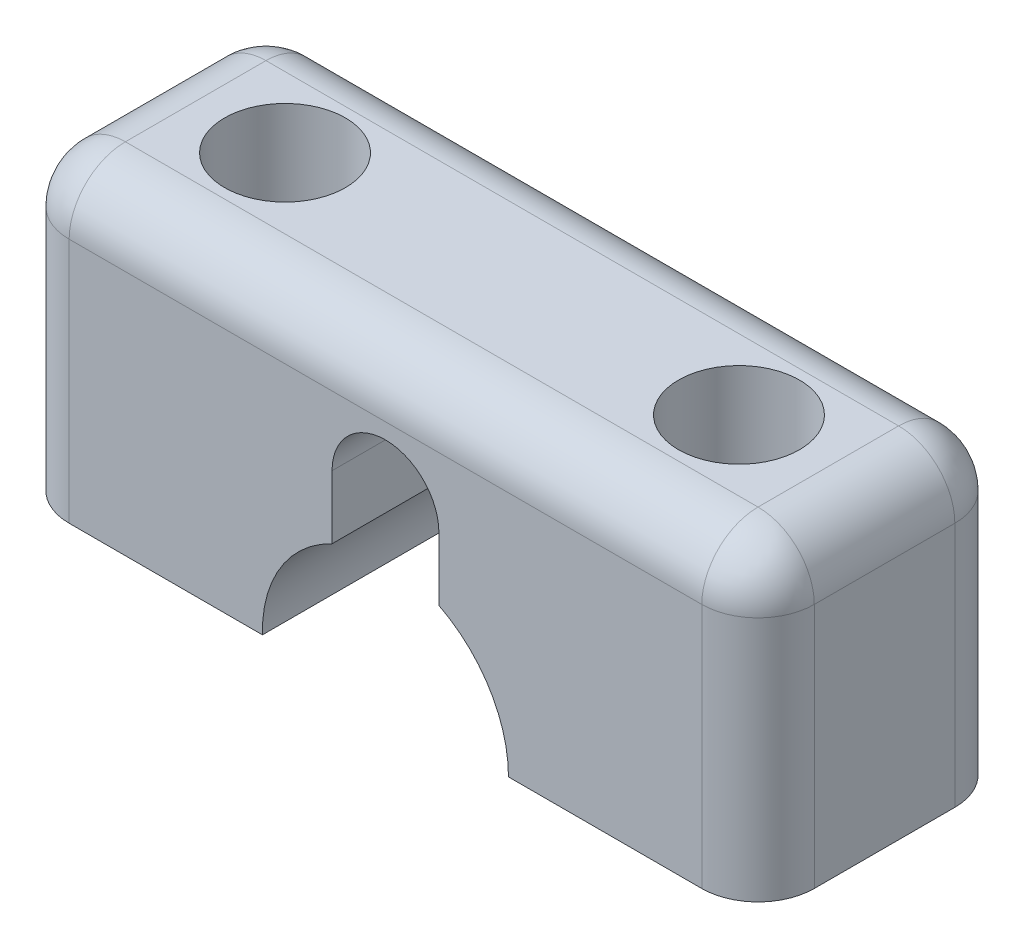
ISO-10303-21;
HEADER;
FILE_DESCRIPTION(('STEP AP214'),'2;1');
FILE_NAME('part.step','',(''),(''),'','','');
FILE_SCHEMA(('AUTOMOTIVE_DESIGN { 1 0 10303 214 1 1 1 1 }'));
ENDSEC;
DATA;
#1=APPLICATION_CONTEXT('core data for automotive mechanical design processes');
#2=APPLICATION_PROTOCOL_DEFINITION('international standard','automotive_design',2000,#1);
#3=PRODUCT_CONTEXT('',#1,'mechanical');
#4=PRODUCT('Part','Part','',(#3));
#5=PRODUCT_RELATED_PRODUCT_CATEGORY('part','',(#4));
#6=PRODUCT_DEFINITION_FORMATION('','',#4);
#7=PRODUCT_DEFINITION_CONTEXT('part definition',#1,'design');
#8=PRODUCT_DEFINITION('design','',#6,#7);
#9=PRODUCT_DEFINITION_SHAPE('','',#8);
#10=(LENGTH_UNIT() NAMED_UNIT(*) SI_UNIT(.MILLI.,.METRE.));
#11=(NAMED_UNIT(*) PLANE_ANGLE_UNIT() SI_UNIT($,.RADIAN.));
#12=(NAMED_UNIT(*) SI_UNIT($,.STERADIAN.) SOLID_ANGLE_UNIT());
#13=UNCERTAINTY_MEASURE_WITH_UNIT(LENGTH_MEASURE(1.E-05),#10,'distance_accuracy_value','');
#14=(GEOMETRIC_REPRESENTATION_CONTEXT(3) GLOBAL_UNCERTAINTY_ASSIGNED_CONTEXT((#13)) GLOBAL_UNIT_ASSIGNED_CONTEXT((#10,
#11,#12)) REPRESENTATION_CONTEXT('',''));
#15=CARTESIAN_POINT('',(0.,0.,0.));
#16=DIRECTION('',(0.,0.,1.));
#17=DIRECTION('',(1.,0.,0.));
#18=AXIS2_PLACEMENT_3D('',#15,#16,#17);
#19=CARTESIAN_POINT('',(0.,117.699465093686,100.));
#20=DIRECTION('',(0.,1.,0.));
#21=DIRECTION('',(0.,0.,1.));
#22=AXIS2_PLACEMENT_3D('',#19,#20,#21);
#23=PLANE('',#22);
#24=CARTESIAN_POINT('',(961.100411774361,117.699465093686,0.));
#25=DIRECTION('',(0.,1.,0.));
#26=DIRECTION('',(0.,0.,1.));
#27=AXIS2_PLACEMENT_3D('',#24,#25,#26);
#28=CIRCLE('',#27,42.9999999999999);
#29=CARTESIAN_POINT('',(961.100411774361,117.699465093686,42.9999999999999));
#30=VERTEX_POINT('',#29);
#31=EDGE_CURVE('E372',#30,#30,#28,.T.);
#32=ORIENTED_EDGE('',*,*,#31,.T.);
#33=EDGE_LOOP('',(#32));
#34=FACE_BOUND('',#33,.T.);
#35=DIRECTION('',(-1.,0.,0.));
#36=VECTOR('',#35,1.);
#37=CARTESIAN_POINT('',(1525.554159827,117.699465093686,179.999999999996));
#38=LINE('',#37,#36);
#39=CARTESIAN_POINT('',(1088.17560525442,117.699465093686,180.));
#40=VERTEX_POINT('',#39);
#41=CARTESIAN_POINT('',(813.175605254417,117.699465093686,180.000000000002));
#42=VERTEX_POINT('',#41);
#43=EDGE_CURVE('E177',#40,#42,#38,.T.);
#44=ORIENTED_EDGE('',*,*,#43,.T.);
#45=DIRECTION('',(0.,0.,-1.));
#46=VECTOR('',#45,1.);
#47=CARTESIAN_POINT('',(813.175605254417,117.699465093686,180.000000000002));
#48=LINE('',#47,#46);
#49=CARTESIAN_POINT('',(813.175605254417,117.699465093686,99.9999999999984));
#50=VERTEX_POINT('',#49);
#51=EDGE_CURVE('E159',#42,#50,#48,.T.);
#52=ORIENTED_EDGE('',*,*,#51,.T.);
#53=DIRECTION('',(0.,0.,-1.));
#54=VECTOR('',#53,1.);
#55=CARTESIAN_POINT('',(813.175605254417,117.699465093686,100.));
#56=LINE('',#55,#54);
#57=CARTESIAN_POINT('',(813.175605254416,117.699465093686,-99.9999999999983));
#58=VERTEX_POINT('',#57);
#59=EDGE_CURVE('E286',#50,#58,#56,.T.);
#60=ORIENTED_EDGE('',*,*,#59,.T.);
#61=CARTESIAN_POINT('',(813.175605254416,117.699465093685,-179.999999999999));
#62=VERTEX_POINT('',#61);
#63=EDGE_CURVE('E171',#58,#62,#48,.T.);
#64=ORIENTED_EDGE('',*,*,#63,.T.);
#65=DIRECTION('',(1.,0.,0.));
#66=VECTOR('',#65,1.);
#67=CARTESIAN_POINT('',(-249.202949318165,117.699465093686,-179.999999999995));
#68=LINE('',#67,#66);
#69=CARTESIAN_POINT('',(1088.17560525442,117.699465093686,-180.));
#70=VERTEX_POINT('',#69);
#71=EDGE_CURVE('E216',#62,#70,#68,.T.);
#72=ORIENTED_EDGE('',*,*,#71,.T.);
#73=CARTESIAN_POINT('',(1088.17560525442,117.699465093686,-100.));
#74=DIRECTION('',(0.,-1.,0.));
#75=DIRECTION('',(0.,0.,-1.));
#76=AXIS2_PLACEMENT_3D('',#73,#74,#75);
#77=CIRCLE('',#76,79.9999999999997);
#78=CARTESIAN_POINT('',(1168.17560525442,117.699465093686,-100.));
#79=VERTEX_POINT('',#78);
#80=EDGE_CURVE('E242',#70,#79,#77,.T.);
#81=ORIENTED_EDGE('',*,*,#80,.T.);
#82=DIRECTION('',(0.,0.,-1.));
#83=VECTOR('',#82,1.);
#84=CARTESIAN_POINT('',(1168.17560525442,117.699465093686,100.));
#85=LINE('',#84,#83);
#86=CARTESIAN_POINT('',(1168.17560525442,117.699465093686,100.));
#87=VERTEX_POINT('',#86);
#88=EDGE_CURVE('E284',#87,#79,#85,.T.);
#89=ORIENTED_EDGE('',*,*,#88,.F.);
#90=CARTESIAN_POINT('',(1088.17560525442,117.699465093686,100.));
#91=DIRECTION('',(0.,1.,0.));
#92=DIRECTION('',(0.,0.,1.));
#93=AXIS2_PLACEMENT_3D('',#90,#91,#92);
#94=CIRCLE('',#93,79.9999999999999);
#95=EDGE_CURVE('E185',#40,#87,#94,.T.);
#96=ORIENTED_EDGE('',*,*,#95,.F.);
#97=EDGE_LOOP('',(#44,#52,#60,#64,#72,#81,#89,#96));
#98=FACE_BOUND('',#97,.T.);
#99=ADVANCED_FACE('F35',(#34,#98),#23,.F.);
#100=CARTESIAN_POINT('',(0.,547.699465093685,100.));
#101=DIRECTION('',(0.,-1.,0.));
#102=DIRECTION('',(0.,0.,-1.));
#103=AXIS2_PLACEMENT_3D('',#100,#101,#102);
#104=PLANE('',#103);
#105=CARTESIAN_POINT('',(961.100411774361,547.699465093685,0.));
#106=DIRECTION('',(0.,1.,0.));
#107=DIRECTION('',(0.,0.,1.));
#108=AXIS2_PLACEMENT_3D('',#105,#106,#107);
#109=CIRCLE('',#108,86.0000000000002);
#110=CARTESIAN_POINT('',(961.100411774361,547.699465093685,86.0000000000002));
#111=VERTEX_POINT('',#110);
#112=EDGE_CURVE('E383',#111,#111,#109,.T.);
#113=ORIENTED_EDGE('',*,*,#112,.F.);
#114=EDGE_LOOP('',(#113));
#115=FACE_BOUND('',#114,.T.);
#116=CARTESIAN_POINT('',(315.250798734472,547.699465093685,1.11022302462516E-13));
#117=DIRECTION('',(0.,1.,0.));
#118=DIRECTION('',(0.,0.,-1.));
#119=AXIS2_PLACEMENT_3D('',#116,#117,#118);
#120=CIRCLE('',#119,86.0000000000002);
#121=CARTESIAN_POINT('',(315.250798734472,547.699465093685,-86.));
#122=VERTEX_POINT('',#121);
#123=EDGE_CURVE('E195',#122,#122,#120,.T.);
#124=ORIENTED_EDGE('',*,*,#123,.F.);
#125=EDGE_LOOP('',(#124));
#126=FACE_BOUND('',#125,.T.);
#127=DIRECTION('',(-1.,0.,0.));
#128=VECTOR('',#127,1.);
#129=CARTESIAN_POINT('',(0.,547.699465093685,-100.));
#130=LINE('',#129,#128);
#131=CARTESIAN_POINT('',(1088.17560525442,547.699465093686,-99.9999999999999));
#132=VERTEX_POINT('',#131);
#133=CARTESIAN_POINT('',(188.175605254416,547.699465093686,-99.9999999999967));
#134=VERTEX_POINT('',#133);
#135=EDGE_CURVE('E245',#132,#134,#130,.T.);
#136=ORIENTED_EDGE('',*,*,#135,.T.);
#137=DIRECTION('',(0.,0.,-1.));
#138=VECTOR('',#137,1.);
#139=CARTESIAN_POINT('',(188.175605254416,547.699465093685,100.));
#140=LINE('',#139,#138);
#141=CARTESIAN_POINT('',(188.175605254416,547.699465093685,100.));
#142=VERTEX_POINT('',#141);
#143=EDGE_CURVE('E11',#142,#134,#140,.T.);
#144=ORIENTED_EDGE('',*,*,#143,.F.);
#145=DIRECTION('',(-1.,0.,0.));
#146=VECTOR('',#145,1.);
#147=CARTESIAN_POINT('',(0.,547.699465093685,100.));
#148=LINE('',#147,#146);
#149=CARTESIAN_POINT('',(1088.17560525442,547.699465093685,100.));
#150=VERTEX_POINT('',#149);
#151=EDGE_CURVE('E246',#150,#142,#148,.T.);
#152=ORIENTED_EDGE('',*,*,#151,.F.);
#153=DIRECTION('',(0.,0.,-1.));
#154=VECTOR('',#153,1.);
#155=CARTESIAN_POINT('',(1088.17560525442,547.699465093685,100.));
#156=LINE('',#155,#154);
#157=EDGE_CURVE('E265',#150,#132,#156,.T.);
#158=ORIENTED_EDGE('',*,*,#157,.T.);
#159=EDGE_LOOP('',(#136,#144,#152,#158));
#160=FACE_BOUND('',#159,.T.);
#161=ADVANCED_FACE('F37',(#115,#126,#160),#104,.F.);
#162=CARTESIAN_POINT('',(188.175605254416,467.699465093685,100.));
#163=DIRECTION('',(0.,0.,-1.));
#164=DIRECTION('',(-1.,0.,0.));
#165=AXIS2_PLACEMENT_3D('',#162,#163,#164);
#166=CYLINDRICAL_SURFACE('',#165,80.0000000000001);
#167=CARTESIAN_POINT('',(188.175605254416,467.699465093685,-100.));
#168=DIRECTION('',(0.,0.,1.));
#169=DIRECTION('',(1.,0.,0.));
#170=AXIS2_PLACEMENT_3D('',#167,#168,#169);
#171=CIRCLE('',#170,80.0000000000001);
#172=CARTESIAN_POINT('',(108.175605254416,467.699465093685,-100.));
#173=VERTEX_POINT('',#172);
#174=EDGE_CURVE('E267',#134,#173,#171,.T.);
#175=ORIENTED_EDGE('',*,*,#174,.T.);
#176=DIRECTION('',(0.,0.,-1.));
#177=VECTOR('',#176,1.);
#178=CARTESIAN_POINT('',(108.175605254416,467.699465093685,100.));
#179=LINE('',#178,#177);
#180=CARTESIAN_POINT('',(108.175605254416,467.699465093685,100.));
#181=VERTEX_POINT('',#180);
#182=EDGE_CURVE('E43',#181,#173,#179,.T.);
#183=ORIENTED_EDGE('',*,*,#182,.F.);
#184=CARTESIAN_POINT('',(188.175605254416,467.699465093685,100.));
#185=DIRECTION('',(0.,0.,1.));
#186=DIRECTION('',(1.,0.,0.));
#187=AXIS2_PLACEMENT_3D('',#184,#185,#186);
#188=CIRCLE('',#187,80.0000000000001);
#189=EDGE_CURVE('E249',#142,#181,#188,.T.);
#190=ORIENTED_EDGE('',*,*,#189,.F.);
#191=ORIENTED_EDGE('',*,*,#143,.T.);
#192=EDGE_LOOP('',(#175,#183,#190,#191));
#193=FACE_BOUND('',#192,.T.);
#194=ADVANCED_FACE('F308',(#193),#166,.T.);
#195=CARTESIAN_POINT('',(108.175605254416,0.,100.));
#196=DIRECTION('',(1.,0.,0.));
#197=DIRECTION('',(0.,1.,0.));
#198=AXIS2_PLACEMENT_3D('',#195,#196,#197);
#199=PLANE('',#198);
#200=DIRECTION('',(0.,-1.,0.));
#201=VECTOR('',#200,1.);
#202=CARTESIAN_POINT('',(108.175605254416,0.,-100.));
#203=LINE('',#202,#201);
#204=CARTESIAN_POINT('',(108.175605254416,117.699465093686,-100.));
#205=VERTEX_POINT('',#204);
#206=EDGE_CURVE('E270',#173,#205,#203,.T.);
#207=ORIENTED_EDGE('',*,*,#206,.T.);
#208=DIRECTION('',(0.,0.,-1.));
#209=VECTOR('',#208,1.);
#210=CARTESIAN_POINT('',(108.175605254416,117.699465093686,100.));
#211=LINE('',#210,#209);
#212=CARTESIAN_POINT('',(108.175605254416,117.699465093686,100.));
#213=VERTEX_POINT('',#212);
#214=EDGE_CURVE('E297',#213,#205,#211,.T.);
#215=ORIENTED_EDGE('',*,*,#214,.F.);
#216=DIRECTION('',(0.,-1.,0.));
#217=VECTOR('',#216,1.);
#218=CARTESIAN_POINT('',(108.175605254416,0.,100.));
#219=LINE('',#218,#217);
#220=EDGE_CURVE('E253',#181,#213,#219,.T.);
#221=ORIENTED_EDGE('',*,*,#220,.F.);
#222=ORIENTED_EDGE('',*,*,#182,.T.);
#223=EDGE_LOOP('',(#207,#215,#221,#222));
#224=FACE_BOUND('',#223,.T.);
#225=ADVANCED_FACE('F303',(#224),#199,.F.);
#226=CARTESIAN_POINT('',(637.111532433096,122.421036494507,100.));
#227=DIRECTION('',(0.,0.,-1.));
#228=DIRECTION('',(-1.,0.,0.));
#229=AXIS2_PLACEMENT_3D('',#226,#227,#228);
#230=CYLINDRICAL_SURFACE('',#229,174.);
#231=DIRECTION('',(0.,0.,-1.));
#232=VECTOR('',#231,1.);
#233=CARTESIAN_POINT('',(463.175605254416,117.699465093686,100.));
#234=LINE('',#233,#232);
#235=CARTESIAN_POINT('',(463.175605254417,117.699465093686,180.000000000003));
#236=VERTEX_POINT('',#235);
#237=CARTESIAN_POINT('',(463.175605254416,117.699465093686,-179.999999999998));
#238=VERTEX_POINT('',#237);
#239=EDGE_CURVE('E50',#236,#238,#234,.T.);
#240=ORIENTED_EDGE('',*,*,#239,.T.);
#241=CARTESIAN_POINT('',(637.111532433095,122.421036494507,-179.999999999998));
#242=DIRECTION('',(0.,0.,-1.));
#243=DIRECTION('',(1.,0.,0.));
#244=AXIS2_PLACEMENT_3D('',#241,#242,#243);
#245=CIRCLE('',#244,174.);
#246=CARTESIAN_POINT('',(562.175605254416,279.457996532174,-179.999999999998));
#247=VERTEX_POINT('',#246);
#248=EDGE_CURVE('E677',#238,#247,#245,.T.);
#249=ORIENTED_EDGE('',*,*,#248,.T.);
#250=DIRECTION('',(0.,0.,-1.));
#251=VECTOR('',#250,1.);
#252=CARTESIAN_POINT('',(562.175605254416,279.457996532174,100.));
#253=LINE('',#252,#251);
#254=CARTESIAN_POINT('',(562.175605254417,279.457996532174,179.999999999999));
#255=VERTEX_POINT('',#254);
#256=EDGE_CURVE('E55',#255,#247,#253,.T.);
#257=ORIENTED_EDGE('',*,*,#256,.F.);
#258=CARTESIAN_POINT('',(637.111532433097,122.421036494507,180.000000000003));
#259=DIRECTION('',(0.,0.,-1.));
#260=DIRECTION('',(1.,0.,0.));
#261=AXIS2_PLACEMENT_3D('',#258,#259,#260);
#262=CIRCLE('',#261,174.);
#263=EDGE_CURVE('E181',#236,#255,#262,.T.);
#264=ORIENTED_EDGE('',*,*,#263,.F.);
#265=EDGE_LOOP('',(#240,#249,#257,#264));
#266=FACE_BOUND('',#265,.T.);
#267=ADVANCED_FACE('F482',(#266),#230,.F.);
#268=CARTESIAN_POINT('',(562.175605254416,0.,100.));
#269=DIRECTION('',(-1.,0.,0.));
#270=DIRECTION('',(0.,0.,1.));
#271=AXIS2_PLACEMENT_3D('',#268,#269,#270);
#272=PLANE('',#271);
#273=ORIENTED_EDGE('',*,*,#256,.T.);
#274=DIRECTION('',(0.,1.,0.));
#275=VECTOR('',#274,1.);
#276=CARTESIAN_POINT('',(562.175605254416,369.457996532174,-179.999999999998));
#277=LINE('',#276,#275);
#278=CARTESIAN_POINT('',(562.175605254416,369.457996532174,-179.999999999998));
#279=VERTEX_POINT('',#278);
#280=EDGE_CURVE('E672',#247,#279,#277,.T.);
#281=ORIENTED_EDGE('',*,*,#280,.T.);
#282=DIRECTION('',(0.,0.,-1.));
#283=VECTOR('',#282,1.);
#284=CARTESIAN_POINT('',(562.175605254416,369.457996532174,100.));
#285=LINE('',#284,#283);
#286=CARTESIAN_POINT('',(562.175605254417,369.457996532174,180.000000000003));
#287=VERTEX_POINT('',#286);
#288=EDGE_CURVE('E293',#287,#279,#285,.T.);
#289=ORIENTED_EDGE('',*,*,#288,.F.);
#290=DIRECTION('',(0.,1.,0.));
#291=VECTOR('',#290,1.);
#292=CARTESIAN_POINT('',(562.175605254417,369.457996532174,180.000000000003));
#293=LINE('',#292,#291);
#294=EDGE_CURVE('E681',#255,#287,#293,.T.);
#295=ORIENTED_EDGE('',*,*,#294,.F.);
#296=EDGE_LOOP('',(#273,#281,#289,#295));
#297=FACE_BOUND('',#296,.T.);
#298=ADVANCED_FACE('F478',(#297),#272,.F.);
#299=CARTESIAN_POINT('',(638.175605254416,369.457996532174,100.));
#300=DIRECTION('',(0.,0.,-1.));
#301=DIRECTION('',(-1.,0.,0.));
#302=AXIS2_PLACEMENT_3D('',#299,#300,#301);
#303=CYLINDRICAL_SURFACE('',#302,76.);
#304=ORIENTED_EDGE('',*,*,#288,.T.);
#305=CARTESIAN_POINT('',(638.175605254416,369.457996532174,-179.999999999998));
#306=DIRECTION('',(0.,0.,-1.));
#307=DIRECTION('',(1.,0.,0.));
#308=AXIS2_PLACEMENT_3D('',#305,#306,#307);
#309=CIRCLE('',#308,76.);
#310=CARTESIAN_POINT('',(714.175605254416,369.457996532174,-179.999999999999));
#311=VERTEX_POINT('',#310);
#312=EDGE_CURVE('E671',#279,#311,#309,.T.);
#313=ORIENTED_EDGE('',*,*,#312,.T.);
#314=DIRECTION('',(0.,0.,-1.));
#315=VECTOR('',#314,1.);
#316=CARTESIAN_POINT('',(714.175605254416,369.457996532174,100.));
#317=LINE('',#316,#315);
#318=CARTESIAN_POINT('',(714.175605254417,369.457996532174,180.000000000002));
#319=VERTEX_POINT('',#318);
#320=EDGE_CURVE('E291',#319,#311,#317,.T.);
#321=ORIENTED_EDGE('',*,*,#320,.F.);
#322=CARTESIAN_POINT('',(638.175605254417,369.457996532174,180.000000000002));
#323=DIRECTION('',(0.,0.,-1.));
#324=DIRECTION('',(1.,0.,0.));
#325=AXIS2_PLACEMENT_3D('',#322,#323,#324);
#326=CIRCLE('',#325,76.);
#327=EDGE_CURVE('E360',#287,#319,#326,.T.);
#328=ORIENTED_EDGE('',*,*,#327,.F.);
#329=EDGE_LOOP('',(#304,#313,#321,#328));
#330=FACE_BOUND('',#329,.T.);
#331=ADVANCED_FACE('F474',(#330),#303,.F.);
#332=CARTESIAN_POINT('',(714.175605254416,0.,100.));
#333=DIRECTION('',(-1.,0.,0.));
#334=DIRECTION('',(0.,0.,1.));
#335=AXIS2_PLACEMENT_3D('',#332,#333,#334);
#336=PLANE('',#335);
#337=ORIENTED_EDGE('',*,*,#320,.T.);
#338=DIRECTION('',(0.,-1.,0.));
#339=VECTOR('',#338,1.);
#340=CARTESIAN_POINT('',(714.175605254416,279.457996532174,-179.999999999998));
#341=LINE('',#340,#339);
#342=CARTESIAN_POINT('',(714.175605254416,279.457996532174,-179.999999999998));
#343=VERTEX_POINT('',#342);
#344=EDGE_CURVE('E182',#311,#343,#341,.T.);
#345=ORIENTED_EDGE('',*,*,#344,.T.);
#346=DIRECTION('',(0.,0.,-1.));
#347=VECTOR('',#346,1.);
#348=CARTESIAN_POINT('',(714.175605254417,279.457996532174,180.000000000002));
#349=LINE('',#348,#347);
#350=CARTESIAN_POINT('',(714.175605254416,279.457996532174,-99.9999999999985));
#351=VERTEX_POINT('',#350);
#352=EDGE_CURVE('E170',#351,#343,#349,.T.);
#353=ORIENTED_EDGE('',*,*,#352,.F.);
#354=DIRECTION('',(0.,0.,-1.));
#355=VECTOR('',#354,1.);
#356=CARTESIAN_POINT('',(714.175605254416,279.457996532174,100.));
#357=LINE('',#356,#355);
#358=CARTESIAN_POINT('',(714.175605254417,279.457996532174,99.9999999999982));
#359=VERTEX_POINT('',#358);
#360=EDGE_CURVE('E288',#359,#351,#357,.T.);
#361=ORIENTED_EDGE('',*,*,#360,.F.);
#362=CARTESIAN_POINT('',(714.175605254417,279.457996532174,180.000000000002));
#363=VERTEX_POINT('',#362);
#364=EDGE_CURVE('E364',#363,#359,#349,.T.);
#365=ORIENTED_EDGE('',*,*,#364,.F.);
#366=DIRECTION('',(0.,-1.,0.));
#367=VECTOR('',#366,1.);
#368=CARTESIAN_POINT('',(714.175605254417,279.457996532174,180.000000000002));
#369=LINE('',#368,#367);
#370=EDGE_CURVE('E180',#319,#363,#369,.T.);
#371=ORIENTED_EDGE('',*,*,#370,.F.);
#372=EDGE_LOOP('',(#337,#345,#353,#361,#365,#371));
#373=FACE_BOUND('',#372,.T.);
#374=ADVANCED_FACE('F470',(#373),#336,.T.);
#375=CARTESIAN_POINT('',(639.239678075737,122.421036494507,100.));
#376=DIRECTION('',(0.,0.,-1.));
#377=DIRECTION('',(-1.,0.,0.));
#378=AXIS2_PLACEMENT_3D('',#375,#376,#377);
#379=CYLINDRICAL_SURFACE('',#378,174.);
#380=CARTESIAN_POINT('',(639.239678075737,122.421036494507,-100.));
#381=DIRECTION('',(0.,0.,1.));
#382=DIRECTION('',(1.,0.,0.));
#383=AXIS2_PLACEMENT_3D('',#380,#381,#382);
#384=CIRCLE('',#383,174.);
#385=EDGE_CURVE('E273',#351,#58,#384,.F.);
#386=ORIENTED_EDGE('',*,*,#385,.T.);
#387=ORIENTED_EDGE('',*,*,#59,.F.);
#388=CARTESIAN_POINT('',(639.239678075737,122.421036494507,100.));
#389=DIRECTION('',(0.,0.,1.));
#390=DIRECTION('',(1.,0.,0.));
#391=AXIS2_PLACEMENT_3D('',#388,#389,#390);
#392=CIRCLE('',#391,174.);
#393=EDGE_CURVE('E256',#359,#50,#392,.F.);
#394=ORIENTED_EDGE('',*,*,#393,.F.);
#395=ORIENTED_EDGE('',*,*,#360,.T.);
#396=EDGE_LOOP('',(#386,#387,#394,#395));
#397=FACE_BOUND('',#396,.T.);
#398=ADVANCED_FACE('F466',(#397),#379,.F.);
#399=CARTESIAN_POINT('',(315.250798734472,117.699465093686,1.11022302462516E-13));
#400=DIRECTION('',(0.,1.,0.));
#401=DIRECTION('',(0.,0.,1.));
#402=AXIS2_PLACEMENT_3D('',#399,#400,#401);
#403=CIRCLE('',#402,42.9999999999999);
#404=CARTESIAN_POINT('',(315.250798734472,117.699465093686,43.));
#405=VERTEX_POINT('',#404);
#406=EDGE_CURVE('E378',#405,#405,#403,.T.);
#407=ORIENTED_EDGE('',*,*,#406,.T.);
#408=EDGE_LOOP('',(#407));
#409=FACE_BOUND('',#408,.T.);
#410=CARTESIAN_POINT('',(188.175605254417,117.699465093686,-180.));
#411=VERTEX_POINT('',#410);
#412=EDGE_CURVE('E217',#411,#238,#68,.T.);
#413=ORIENTED_EDGE('',*,*,#412,.T.);
#414=ORIENTED_EDGE('',*,*,#239,.F.);
#415=CARTESIAN_POINT('',(188.175605254417,117.699465093686,180.));
#416=VERTEX_POINT('',#415);
#417=EDGE_CURVE('E188',#236,#416,#38,.T.);
#418=ORIENTED_EDGE('',*,*,#417,.T.);
#419=CARTESIAN_POINT('',(188.175605254417,117.699465093686,100.));
#420=DIRECTION('',(0.,-1.,0.));
#421=DIRECTION('',(1.,0.,0.));
#422=AXIS2_PLACEMENT_3D('',#419,#420,#421);
#423=CIRCLE('',#422,80.0000000000004);
#424=EDGE_CURVE('E205',#416,#213,#423,.T.);
#425=ORIENTED_EDGE('',*,*,#424,.T.);
#426=ORIENTED_EDGE('',*,*,#214,.T.);
#427=CARTESIAN_POINT('',(188.175605254416,117.699465093686,-100.));
#428=DIRECTION('',(0.,1.,0.));
#429=DIRECTION('',(0.,0.,1.));
#430=AXIS2_PLACEMENT_3D('',#427,#428,#429);
#431=CIRCLE('',#430,80.0000000000001);
#432=EDGE_CURVE('E231',#411,#205,#431,.T.);
#433=ORIENTED_EDGE('',*,*,#432,.F.);
#434=EDGE_LOOP('',(#413,#414,#418,#425,#426,#433));
#435=FACE_BOUND('',#434,.T.);
#436=ADVANCED_FACE('F327',(#409,#435),#23,.F.);
#437=CARTESIAN_POINT('',(1168.17560525442,-7.41105973576503E-13,100.));
#438=DIRECTION('',(-1.,0.,0.));
#439=DIRECTION('',(0.,-1.,0.));
#440=AXIS2_PLACEMENT_3D('',#437,#438,#439);
#441=PLANE('',#440);
#442=DIRECTION('',(0.,1.,0.));
#443=VECTOR('',#442,1.);
#444=CARTESIAN_POINT('',(1168.17560525442,-7.41105973576503E-13,-100.));
#445=LINE('',#444,#443);
#446=CARTESIAN_POINT('',(1168.17560525442,467.699465093686,-100.));
#447=VERTEX_POINT('',#446);
#448=EDGE_CURVE('E276',#79,#447,#445,.T.);
#449=ORIENTED_EDGE('',*,*,#448,.T.);
#450=DIRECTION('',(0.,0.,-1.));
#451=VECTOR('',#450,1.);
#452=CARTESIAN_POINT('',(1168.17560525442,467.699465093686,100.));
#453=LINE('',#452,#451);
#454=CARTESIAN_POINT('',(1168.17560525442,467.699465093686,100.));
#455=VERTEX_POINT('',#454);
#456=EDGE_CURVE('E281',#455,#447,#453,.T.);
#457=ORIENTED_EDGE('',*,*,#456,.F.);
#458=DIRECTION('',(0.,1.,0.));
#459=VECTOR('',#458,1.);
#460=CARTESIAN_POINT('',(1168.17560525442,-7.41105973576503E-13,100.));
#461=LINE('',#460,#459);
#462=EDGE_CURVE('E259',#87,#455,#461,.T.);
#463=ORIENTED_EDGE('',*,*,#462,.F.);
#464=ORIENTED_EDGE('',*,*,#88,.T.);
#465=EDGE_LOOP('',(#449,#457,#463,#464));
#466=FACE_BOUND('',#465,.T.);
#467=ADVANCED_FACE('F461',(#466),#441,.F.);
#468=CARTESIAN_POINT('',(1088.17560525442,467.699465093686,100.));
#469=DIRECTION('',(0.,0.,-1.));
#470=DIRECTION('',(-1.,0.,0.));
#471=AXIS2_PLACEMENT_3D('',#468,#469,#470);
#472=CYLINDRICAL_SURFACE('',#471,80.);
#473=CARTESIAN_POINT('',(1088.17560525442,467.699465093686,-100.));
#474=DIRECTION('',(0.,0.,1.));
#475=DIRECTION('',(1.,0.,0.));
#476=AXIS2_PLACEMENT_3D('',#473,#474,#475);
#477=CIRCLE('',#476,80.);
#478=EDGE_CURVE('E250',#447,#132,#477,.T.);
#479=ORIENTED_EDGE('',*,*,#478,.T.);
#480=ORIENTED_EDGE('',*,*,#157,.F.);
#481=CARTESIAN_POINT('',(1088.17560525442,467.699465093686,100.));
#482=DIRECTION('',(0.,0.,1.));
#483=DIRECTION('',(1.,0.,0.));
#484=AXIS2_PLACEMENT_3D('',#481,#482,#483);
#485=CIRCLE('',#484,80.);
#486=EDGE_CURVE('E262',#455,#150,#485,.T.);
#487=ORIENTED_EDGE('',*,*,#486,.F.);
#488=ORIENTED_EDGE('',*,*,#456,.T.);
#489=EDGE_LOOP('',(#479,#480,#487,#488));
#490=FACE_BOUND('',#489,.T.);
#491=ADVANCED_FACE('F345',(#490),#472,.T.);
#492=CARTESIAN_POINT('',(1088.17560525442,467.699465093686,-100.));
#493=DIRECTION('',(0.,-1.,0.));
#494=DIRECTION('',(0.,0.,1.));
#495=AXIS2_PLACEMENT_3D('',#492,#493,#494);
#496=SPHERICAL_SURFACE('',#495,79.9999999999999);
#497=ORIENTED_EDGE('',*,*,#478,.F.);
#498=CARTESIAN_POINT('',(1088.17560525442,467.699465093686,-100.));
#499=DIRECTION('',(0.,-1.,0.));
#500=DIRECTION('',(0.,0.,-1.));
#501=AXIS2_PLACEMENT_3D('',#498,#499,#500);
#502=CIRCLE('',#501,79.9999999999999);
#503=CARTESIAN_POINT('',(1088.17560525442,467.699465093686,-180.));
#504=VERTEX_POINT('',#503);
#505=EDGE_CURVE('E239',#504,#447,#502,.T.);
#506=ORIENTED_EDGE('',*,*,#505,.F.);
#507=CARTESIAN_POINT('',(1088.17560525442,467.699465093686,-100.));
#508=DIRECTION('',(-1.,0.,0.));
#509=DIRECTION('',(0.,0.,-1.));
#510=AXIS2_PLACEMENT_3D('',#507,#508,#509);
#511=CIRCLE('',#510,79.9999999999999);
#512=EDGE_CURVE('E233',#132,#504,#511,.T.);
#513=ORIENTED_EDGE('',*,*,#512,.F.);
#514=EDGE_LOOP('',(#497,#506,#513));
#515=FACE_BOUND('',#514,.T.);
#516=ADVANCED_FACE('F348',(#515),#496,.T.);
#517=CARTESIAN_POINT('',(1088.17560525442,547.699465093686,-100.));
#518=DIRECTION('',(0.,-1.,0.));
#519=DIRECTION('',(0.,0.,-1.));
#520=AXIS2_PLACEMENT_3D('',#517,#518,#519);
#521=CYLINDRICAL_SURFACE('',#520,79.9999999999998);
#522=DIRECTION('',(0.,-1.,0.));
#523=VECTOR('',#522,1.);
#524=CARTESIAN_POINT('',(1088.17560525442,117.699465093686,-180.));
#525=LINE('',#524,#523);
#526=EDGE_CURVE('E236',#504,#70,#525,.T.);
#527=ORIENTED_EDGE('',*,*,#526,.F.);
#528=ORIENTED_EDGE('',*,*,#505,.T.);
#529=ORIENTED_EDGE('',*,*,#448,.F.);
#530=ORIENTED_EDGE('',*,*,#80,.F.);
#531=EDGE_LOOP('',(#527,#528,#529,#530));
#532=FACE_BOUND('',#531,.T.);
#533=ADVANCED_FACE('F353',(#532),#521,.T.);
#534=CARTESIAN_POINT('',(188.175605254416,467.699465093685,-99.9999999999998));
#535=DIRECTION('',(0.,1.,0.));
#536=DIRECTION('',(0.,0.,-1.));
#537=AXIS2_PLACEMENT_3D('',#534,#535,#536);
#538=SPHERICAL_SURFACE('',#537,80.0000000000002);
#539=ORIENTED_EDGE('',*,*,#174,.F.);
#540=CARTESIAN_POINT('',(188.175605254416,467.699465093685,-99.9999999999998));
#541=DIRECTION('',(1.,0.,0.));
#542=DIRECTION('',(0.,0.,-1.));
#543=AXIS2_PLACEMENT_3D('',#540,#541,#542);
#544=CIRCLE('',#543,80.0000000000002);
#545=CARTESIAN_POINT('',(188.175605254417,467.699465093685,-180.));
#546=VERTEX_POINT('',#545);
#547=EDGE_CURVE('E223',#546,#134,#544,.T.);
#548=ORIENTED_EDGE('',*,*,#547,.F.);
#549=CARTESIAN_POINT('',(188.175605254416,467.699465093685,-100.));
#550=DIRECTION('',(0.,1.,0.));
#551=DIRECTION('',(0.,0.,1.));
#552=AXIS2_PLACEMENT_3D('',#549,#550,#551);
#553=CIRCLE('',#552,80.);
#554=EDGE_CURVE('E229',#546,#173,#553,.T.);
#555=ORIENTED_EDGE('',*,*,#554,.T.);
#556=EDGE_LOOP('',(#539,#548,#555));
#557=FACE_BOUND('',#556,.T.);
#558=ADVANCED_FACE('F313',(#557),#538,.T.);
#559=CARTESIAN_POINT('',(188.175605254416,547.699465093685,-100.));
#560=DIRECTION('',(0.,1.,0.));
#561=DIRECTION('',(0.,0.,1.));
#562=AXIS2_PLACEMENT_3D('',#559,#560,#561);
#563=CYLINDRICAL_SURFACE('',#562,80.0000000000001);
#564=DIRECTION('',(0.,1.,0.));
#565=VECTOR('',#564,1.);
#566=CARTESIAN_POINT('',(188.175605254417,117.699465093686,-180.));
#567=LINE('',#566,#565);
#568=EDGE_CURVE('E226',#411,#546,#567,.T.);
#569=ORIENTED_EDGE('',*,*,#568,.F.);
#570=ORIENTED_EDGE('',*,*,#432,.T.);
#571=ORIENTED_EDGE('',*,*,#206,.F.);
#572=ORIENTED_EDGE('',*,*,#554,.F.);
#573=EDGE_LOOP('',(#569,#570,#571,#572));
#574=FACE_BOUND('',#573,.T.);
#575=ADVANCED_FACE('F325',(#574),#563,.T.);
#576=CARTESIAN_POINT('',(-249.202949318164,0.,-99.9999999999952));
#577=DIRECTION('',(0.,0.,-1.));
#578=DIRECTION('',(-1.,0.,0.));
#579=AXIS2_PLACEMENT_3D('',#576,#577,#578);
#580=PLANE('',#579);
#581=ORIENTED_EDGE('',*,*,#385,.F.);
#582=CARTESIAN_POINT('',(631.524986602213,117.699465093686,-99.9999999999983));
#583=DIRECTION('',(0.,0.,-1.));
#584=DIRECTION('',(-1.,0.,0.));
#585=AXIS2_PLACEMENT_3D('',#582,#583,#584);
#586=CIRCLE('',#585,181.650618652203);
#587=EDGE_CURVE('E367',#351,#58,#586,.T.);
#588=ORIENTED_EDGE('',*,*,#587,.T.);
#589=EDGE_LOOP('',(#581,#588));
#590=FACE_BOUND('',#589,.T.);
#591=ADVANCED_FACE('F443',(#590),#580,.F.);
#592=CARTESIAN_POINT('',(-249.202949318165,-1.14194368247157E-13,-179.999999999995));
#593=DIRECTION('',(0.,0.,1.));
#594=DIRECTION('',(1.,0.,0.));
#595=AXIS2_PLACEMENT_3D('',#592,#593,#594);
#596=PLANE('',#595);
#597=ORIENTED_EDGE('',*,*,#71,.F.);
#598=CARTESIAN_POINT('',(631.524986602213,117.699465093686,-179.999999999998));
#599=DIRECTION('',(0.,0.,-1.));
#600=DIRECTION('',(1.,0.,0.));
#601=AXIS2_PLACEMENT_3D('',#598,#599,#600);
#602=CIRCLE('',#601,181.650618652203);
#603=EDGE_CURVE('E356',#343,#62,#602,.T.);
#604=ORIENTED_EDGE('',*,*,#603,.F.);
#605=ORIENTED_EDGE('',*,*,#344,.F.);
#606=ORIENTED_EDGE('',*,*,#312,.F.);
#607=ORIENTED_EDGE('',*,*,#280,.F.);
#608=ORIENTED_EDGE('',*,*,#248,.F.);
#609=ORIENTED_EDGE('',*,*,#412,.F.);
#610=ORIENTED_EDGE('',*,*,#568,.T.);
#611=DIRECTION('',(1.,0.,0.));
#612=VECTOR('',#611,1.);
#613=CARTESIAN_POINT('',(-249.202949318165,467.699465093686,-179.999999999995));
#614=LINE('',#613,#612);
#615=EDGE_CURVE('E220',#546,#504,#614,.T.);
#616=ORIENTED_EDGE('',*,*,#615,.T.);
#617=ORIENTED_EDGE('',*,*,#526,.T.);
#618=EDGE_LOOP('',(#597,#604,#605,#606,#607,#608,#609,#610,#616,#617));
#619=FACE_BOUND('',#618,.T.);
#620=ADVANCED_FACE('F323',(#619),#596,.F.);
#621=CARTESIAN_POINT('',(-249.202949318164,467.699465093686,-99.9999999999954));
#622=DIRECTION('',(1.,0.,0.));
#623=DIRECTION('',(0.,0.,-1.));
#624=AXIS2_PLACEMENT_3D('',#621,#622,#623);
#625=CYLINDRICAL_SURFACE('',#624,79.9999999999999);
#626=ORIENTED_EDGE('',*,*,#615,.F.);
#627=ORIENTED_EDGE('',*,*,#547,.T.);
#628=ORIENTED_EDGE('',*,*,#135,.F.);
#629=ORIENTED_EDGE('',*,*,#512,.T.);
#630=EDGE_LOOP('',(#626,#627,#628,#629));
#631=FACE_BOUND('',#630,.T.);
#632=ADVANCED_FACE('F317',(#631),#625,.T.);
#633=CARTESIAN_POINT('',(1088.17560525442,467.699465093686,100.));
#634=DIRECTION('',(0.,1.,0.));
#635=DIRECTION('',(0.,0.,1.));
#636=AXIS2_PLACEMENT_3D('',#633,#634,#635);
#637=SPHERICAL_SURFACE('',#636,79.9999999999998);
#638=ORIENTED_EDGE('',*,*,#486,.T.);
#639=CARTESIAN_POINT('',(1088.17560525442,467.699465093686,100.));
#640=DIRECTION('',(-1.,0.,0.));
#641=DIRECTION('',(0.,0.,1.));
#642=AXIS2_PLACEMENT_3D('',#639,#640,#641);
#643=CIRCLE('',#642,79.9999999999998);
#644=CARTESIAN_POINT('',(1088.17560525442,467.699465093686,180.));
#645=VERTEX_POINT('',#644);
#646=EDGE_CURVE('E207',#645,#150,#643,.T.);
#647=ORIENTED_EDGE('',*,*,#646,.F.);
#648=CARTESIAN_POINT('',(1088.17560525442,467.699465093686,100.));
#649=DIRECTION('',(0.,1.,0.));
#650=DIRECTION('',(0.,0.,1.));
#651=AXIS2_PLACEMENT_3D('',#648,#649,#650);
#652=CIRCLE('',#651,80.0000000000002);
#653=EDGE_CURVE('E212',#645,#455,#652,.T.);
#654=ORIENTED_EDGE('',*,*,#653,.T.);
#655=EDGE_LOOP('',(#638,#647,#654));
#656=FACE_BOUND('',#655,.T.);
#657=ADVANCED_FACE('F343',(#656),#637,.T.);
#658=CARTESIAN_POINT('',(1088.17560525442,547.699465093685,100.));
#659=DIRECTION('',(0.,1.,0.));
#660=DIRECTION('',(0.,0.,1.));
#661=AXIS2_PLACEMENT_3D('',#658,#659,#660);
#662=CYLINDRICAL_SURFACE('',#661,80.);
#663=DIRECTION('',(0.,1.,0.));
#664=VECTOR('',#663,1.);
#665=CARTESIAN_POINT('',(1088.17560525442,117.699465093686,180.));
#666=LINE('',#665,#664);
#667=EDGE_CURVE('E210',#40,#645,#666,.T.);
#668=ORIENTED_EDGE('',*,*,#667,.F.);
#669=ORIENTED_EDGE('',*,*,#95,.T.);
#670=ORIENTED_EDGE('',*,*,#462,.T.);
#671=ORIENTED_EDGE('',*,*,#653,.F.);
#672=EDGE_LOOP('',(#668,#669,#670,#671));
#673=FACE_BOUND('',#672,.T.);
#674=ADVANCED_FACE('F435',(#673),#662,.T.);
#675=CARTESIAN_POINT('',(188.175605254416,467.699465093685,99.9999999999999));
#676=DIRECTION('',(0.,-1.,0.));
#677=DIRECTION('',(0.,0.,1.));
#678=AXIS2_PLACEMENT_3D('',#675,#676,#677);
#679=SPHERICAL_SURFACE('',#678,80.0000000000002);
#680=ORIENTED_EDGE('',*,*,#189,.T.);
#681=CARTESIAN_POINT('',(188.175605254416,467.699465093685,100.));
#682=DIRECTION('',(0.,-1.,0.));
#683=DIRECTION('',(1.,0.,0.));
#684=AXIS2_PLACEMENT_3D('',#681,#682,#683);
#685=CIRCLE('',#684,80.0000000000001);
#686=CARTESIAN_POINT('',(188.175605254417,467.699465093685,180.));
#687=VERTEX_POINT('',#686);
#688=EDGE_CURVE('E203',#687,#181,#685,.T.);
#689=ORIENTED_EDGE('',*,*,#688,.F.);
#690=CARTESIAN_POINT('',(188.175605254416,467.699465093685,99.9999999999999));
#691=DIRECTION('',(1.,0.,0.));
#692=DIRECTION('',(0.,0.,1.));
#693=AXIS2_PLACEMENT_3D('',#690,#691,#692);
#694=CIRCLE('',#693,80.0000000000002);
#695=EDGE_CURVE('E191',#142,#687,#694,.T.);
#696=ORIENTED_EDGE('',*,*,#695,.F.);
#697=EDGE_LOOP('',(#680,#689,#696));
#698=FACE_BOUND('',#697,.T.);
#699=ADVANCED_FACE('F334',(#698),#679,.T.);
#700=CARTESIAN_POINT('',(188.175605254416,547.699465093685,100.));
#701=DIRECTION('',(0.,-1.,0.));
#702=DIRECTION('',(1.,0.,0.));
#703=AXIS2_PLACEMENT_3D('',#700,#701,#702);
#704=CYLINDRICAL_SURFACE('',#703,80.0000000000003);
#705=DIRECTION('',(0.,-1.,0.));
#706=VECTOR('',#705,1.);
#707=CARTESIAN_POINT('',(188.175605254417,117.699465093686,180.));
#708=LINE('',#707,#706);
#709=EDGE_CURVE('E200',#687,#416,#708,.T.);
#710=ORIENTED_EDGE('',*,*,#709,.F.);
#711=ORIENTED_EDGE('',*,*,#688,.T.);
#712=ORIENTED_EDGE('',*,*,#220,.T.);
#713=ORIENTED_EDGE('',*,*,#424,.F.);
#714=EDGE_LOOP('',(#710,#711,#712,#713));
#715=FACE_BOUND('',#714,.T.);
#716=ADVANCED_FACE('F331',(#715),#704,.T.);
#717=CARTESIAN_POINT('',(1525.554159827,547.699465093686,99.9999999999954));
#718=DIRECTION('',(0.,0.,1.));
#719=DIRECTION('',(1.,0.,0.));
#720=AXIS2_PLACEMENT_3D('',#717,#718,#719);
#721=PLANE('',#720);
#722=ORIENTED_EDGE('',*,*,#393,.T.);
#723=CARTESIAN_POINT('',(631.524986602214,117.699465093686,99.9999999999985));
#724=DIRECTION('',(0.,0.,1.));
#725=DIRECTION('',(1.,0.,0.));
#726=AXIS2_PLACEMENT_3D('',#723,#724,#725);
#727=CIRCLE('',#726,181.650618652203);
#728=EDGE_CURVE('E165',#50,#359,#727,.T.);
#729=ORIENTED_EDGE('',*,*,#728,.T.);
#730=EDGE_LOOP('',(#722,#729));
#731=FACE_BOUND('',#730,.T.);
#732=ADVANCED_FACE('F425',(#731),#721,.F.);
#733=CARTESIAN_POINT('',(1525.554159827,117.699465093686,179.999999999996));
#734=DIRECTION('',(0.,0.,-1.));
#735=DIRECTION('',(-1.,0.,0.));
#736=AXIS2_PLACEMENT_3D('',#733,#734,#735);
#737=PLANE('',#736);
#738=ORIENTED_EDGE('',*,*,#370,.T.);
#739=CARTESIAN_POINT('',(631.524986602214,117.699465093686,180.000000000003));
#740=DIRECTION('',(0.,0.,-1.));
#741=DIRECTION('',(1.,0.,0.));
#742=AXIS2_PLACEMENT_3D('',#739,#740,#741);
#743=CIRCLE('',#742,181.650618652203);
#744=EDGE_CURVE('E162',#363,#42,#743,.T.);
#745=ORIENTED_EDGE('',*,*,#744,.T.);
#746=ORIENTED_EDGE('',*,*,#43,.F.);
#747=ORIENTED_EDGE('',*,*,#667,.T.);
#748=DIRECTION('',(-1.,0.,0.));
#749=VECTOR('',#748,1.);
#750=CARTESIAN_POINT('',(1525.554159827,467.699465093686,179.999999999995));
#751=LINE('',#750,#749);
#752=EDGE_CURVE('E187',#645,#687,#751,.T.);
#753=ORIENTED_EDGE('',*,*,#752,.T.);
#754=ORIENTED_EDGE('',*,*,#709,.T.);
#755=ORIENTED_EDGE('',*,*,#417,.F.);
#756=ORIENTED_EDGE('',*,*,#263,.T.);
#757=ORIENTED_EDGE('',*,*,#294,.T.);
#758=ORIENTED_EDGE('',*,*,#327,.T.);
#759=EDGE_LOOP('',(#738,#745,#746,#747,#753,#754,#755,#756,#757,#758));
#760=FACE_BOUND('',#759,.T.);
#761=ADVANCED_FACE('F175',(#760),#737,.F.);
#762=CARTESIAN_POINT('',(1525.554159827,467.699465093686,99.9999999999951));
#763=DIRECTION('',(-1.,0.,0.));
#764=DIRECTION('',(0.,0.,1.));
#765=AXIS2_PLACEMENT_3D('',#762,#763,#764);
#766=CYLINDRICAL_SURFACE('',#765,80.0000000000003);
#767=ORIENTED_EDGE('',*,*,#752,.F.);
#768=ORIENTED_EDGE('',*,*,#646,.T.);
#769=ORIENTED_EDGE('',*,*,#151,.T.);
#770=ORIENTED_EDGE('',*,*,#695,.T.);
#771=EDGE_LOOP('',(#767,#768,#769,#770));
#772=FACE_BOUND('',#771,.T.);
#773=ADVANCED_FACE('F337',(#772),#766,.T.);
#774=CARTESIAN_POINT('',(315.250798734472,412.699465093686,1.11022302462516E-13));
#775=DIRECTION('',(0.,1.,0.));
#776=DIRECTION('',(0.,0.,1.));
#777=AXIS2_PLACEMENT_3D('',#774,#775,#776);
#778=CYLINDRICAL_SURFACE('',#777,86.0000000000002);
#779=CARTESIAN_POINT('',(315.250798734472,412.699465093686,1.11022302462516E-13));
#780=DIRECTION('',(0.,1.,0.));
#781=DIRECTION('',(0.,0.,-1.));
#782=AXIS2_PLACEMENT_3D('',#779,#780,#781);
#783=CIRCLE('',#782,86.0000000000002);
#784=CARTESIAN_POINT('',(315.250798734472,412.699465093686,-86.));
#785=VERTEX_POINT('',#784);
#786=EDGE_CURVE('E385',#785,#785,#783,.T.);
#787=ORIENTED_EDGE('',*,*,#786,.F.);
#788=EDGE_LOOP('',(#787));
#789=FACE_BOUND('',#788,.T.);
#790=ORIENTED_EDGE('',*,*,#123,.T.);
#791=EDGE_LOOP('',(#790));
#792=FACE_BOUND('',#791,.T.);
#793=ADVANCED_FACE('F392',(#789,#792),#778,.F.);
#794=CARTESIAN_POINT('',(315.250798734472,412.699465093686,1.11022302462516E-13));
#795=DIRECTION('',(0.,-1.,0.));
#796=DIRECTION('',(0.,0.,-1.));
#797=AXIS2_PLACEMENT_3D('',#794,#795,#796);
#798=PLANE('',#797);
#799=CARTESIAN_POINT('',(315.250798734472,412.699465093686,1.11022302462516E-13));
#800=DIRECTION('',(0.,-1.,0.));
#801=DIRECTION('',(0.,0.,-1.));
#802=AXIS2_PLACEMENT_3D('',#799,#800,#801);
#803=CIRCLE('',#802,42.9999999999999);
#804=CARTESIAN_POINT('',(315.250798734472,412.699465093686,-42.9999999999997));
#805=VERTEX_POINT('',#804);
#806=EDGE_CURVE('E375',#805,#805,#803,.T.);
#807=ORIENTED_EDGE('',*,*,#806,.T.);
#808=EDGE_LOOP('',(#807));
#809=FACE_BOUND('',#808,.T.);
#810=ORIENTED_EDGE('',*,*,#786,.T.);
#811=EDGE_LOOP('',(#810));
#812=FACE_BOUND('',#811,.T.);
#813=ADVANCED_FACE('F407',(#809,#812),#798,.F.);
#814=CARTESIAN_POINT('',(961.100411774361,412.699465093686,0.));
#815=DIRECTION('',(0.,1.,0.));
#816=DIRECTION('',(0.,0.,1.));
#817=AXIS2_PLACEMENT_3D('',#814,#815,#816);
#818=CYLINDRICAL_SURFACE('',#817,86.0000000000002);
#819=CARTESIAN_POINT('',(961.100411774361,412.699465093686,0.));
#820=DIRECTION('',(0.,1.,0.));
#821=DIRECTION('',(0.,0.,1.));
#822=AXIS2_PLACEMENT_3D('',#819,#820,#821);
#823=CIRCLE('',#822,86.0000000000002);
#824=CARTESIAN_POINT('',(961.100411774361,412.699465093686,86.0000000000002));
#825=VERTEX_POINT('',#824);
#826=EDGE_CURVE('E193',#825,#825,#823,.T.);
#827=ORIENTED_EDGE('',*,*,#826,.F.);
#828=EDGE_LOOP('',(#827));
#829=FACE_BOUND('',#828,.T.);
#830=ORIENTED_EDGE('',*,*,#112,.T.);
#831=EDGE_LOOP('',(#830));
#832=FACE_BOUND('',#831,.T.);
#833=ADVANCED_FACE('F404',(#829,#832),#818,.F.);
#834=CARTESIAN_POINT('',(961.100411774361,412.699465093686,0.));
#835=DIRECTION('',(0.,1.,0.));
#836=DIRECTION('',(0.,0.,1.));
#837=AXIS2_PLACEMENT_3D('',#834,#835,#836);
#838=PLANE('',#837);
#839=CARTESIAN_POINT('',(961.100411774361,412.699465093686,0.));
#840=DIRECTION('',(0.,1.,0.));
#841=DIRECTION('',(0.,0.,1.));
#842=AXIS2_PLACEMENT_3D('',#839,#840,#841);
#843=CIRCLE('',#842,42.9999999999999);
#844=CARTESIAN_POINT('',(961.100411774361,412.699465093686,42.9999999999999));
#845=VERTEX_POINT('',#844);
#846=EDGE_CURVE('E369',#845,#845,#843,.T.);
#847=ORIENTED_EDGE('',*,*,#846,.F.);
#848=EDGE_LOOP('',(#847));
#849=FACE_BOUND('',#848,.T.);
#850=ORIENTED_EDGE('',*,*,#826,.T.);
#851=EDGE_LOOP('',(#850));
#852=FACE_BOUND('',#851,.T.);
#853=ADVANCED_FACE('F406',(#849,#852),#838,.T.);
#854=CARTESIAN_POINT('',(961.100411774361,-35.3005349063148,0.));
#855=DIRECTION('',(0.,1.,0.));
#856=DIRECTION('',(0.,0.,1.));
#857=AXIS2_PLACEMENT_3D('',#854,#855,#856);
#858=CYLINDRICAL_SURFACE('',#857,42.9999999999999);
#859=ORIENTED_EDGE('',*,*,#846,.T.);
#860=EDGE_LOOP('',(#859));
#861=FACE_BOUND('',#860,.T.);
#862=ORIENTED_EDGE('',*,*,#31,.F.);
#863=EDGE_LOOP('',(#862));
#864=FACE_BOUND('',#863,.T.);
#865=ADVANCED_FACE('F414',(#861,#864),#858,.F.);
#866=CARTESIAN_POINT('',(315.250798734472,-35.3005349063148,1.11022302462516E-13));
#867=DIRECTION('',(0.,1.,0.));
#868=DIRECTION('',(0.,0.,1.));
#869=AXIS2_PLACEMENT_3D('',#866,#867,#868);
#870=CYLINDRICAL_SURFACE('',#869,42.9999999999999);
#871=ORIENTED_EDGE('',*,*,#806,.F.);
#872=EDGE_LOOP('',(#871));
#873=FACE_BOUND('',#872,.T.);
#874=ORIENTED_EDGE('',*,*,#406,.F.);
#875=EDGE_LOOP('',(#874));
#876=FACE_BOUND('',#875,.T.);
#877=ADVANCED_FACE('F608',(#873,#876),#870,.F.);
#878=CARTESIAN_POINT('',(631.524986602214,117.699465093686,180.000000000003));
#879=DIRECTION('',(0.,0.,-1.));
#880=DIRECTION('',(-1.,0.,0.));
#881=AXIS2_PLACEMENT_3D('',#878,#879,#880);
#882=CYLINDRICAL_SURFACE('',#881,181.650618652203);
#883=ORIENTED_EDGE('',*,*,#51,.F.);
#884=ORIENTED_EDGE('',*,*,#744,.F.);
#885=ORIENTED_EDGE('',*,*,#364,.T.);
#886=ORIENTED_EDGE('',*,*,#728,.F.);
#887=EDGE_LOOP('',(#883,#884,#885,#886));
#888=FACE_BOUND('',#887,.T.);
#889=ADVANCED_FACE('F161',(#888),#882,.F.);
#890=ORIENTED_EDGE('',*,*,#352,.T.);
#891=ORIENTED_EDGE('',*,*,#603,.T.);
#892=ORIENTED_EDGE('',*,*,#63,.F.);
#893=ORIENTED_EDGE('',*,*,#587,.F.);
#894=EDGE_LOOP('',(#890,#891,#892,#893));
#895=FACE_BOUND('',#894,.T.);
#896=ADVANCED_FACE('F656',(#895),#882,.F.);
#897=CLOSED_SHELL('',(#99,#161,#194,#225,#267,#298,#331,#374,#398,#436,#467,#491,#516,#533,#558,
#575,#591,#620,#632,#657,#674,#699,#716,#732,#761,#773,#793,#813,#833,#853,#865,#877,#889,#896));
#898=MANIFOLD_SOLID_BREP('B2',#897);
#899=ADVANCED_BREP_SHAPE_REPRESENTATION('',(#18,#898),#14);
#900=SHAPE_DEFINITION_REPRESENTATION(#9,#899);
ENDSEC;
END-ISO-10303-21;
